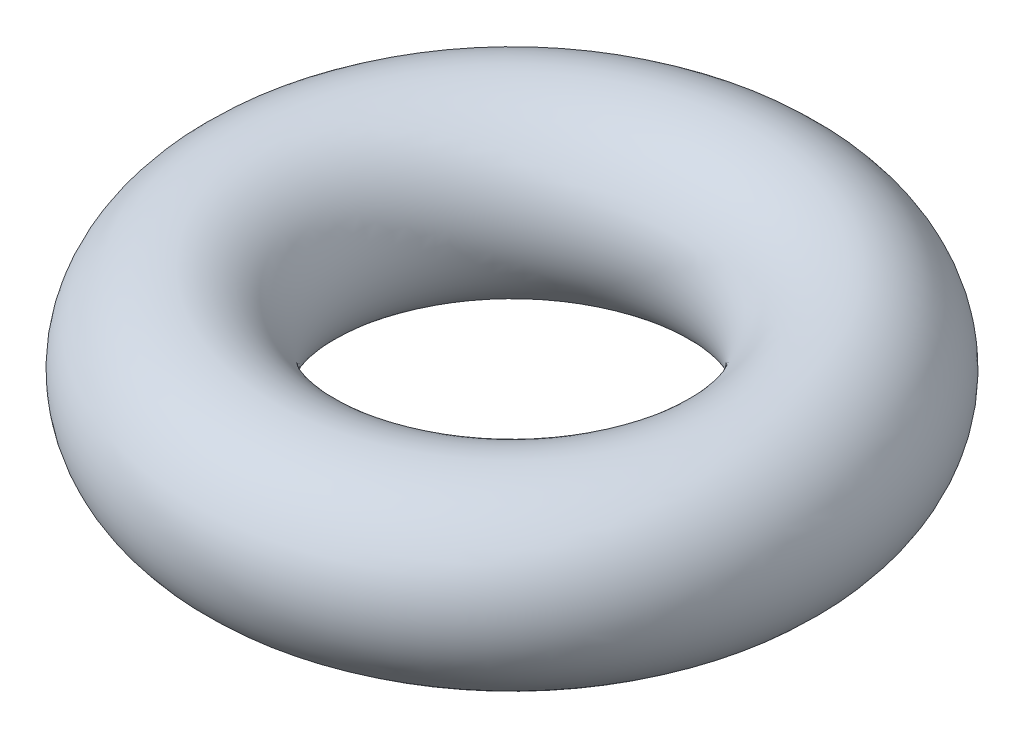
ISO-10303-21;
HEADER;
FILE_DESCRIPTION(('STEP AP214'),'2;1');
FILE_NAME('part.step','',(''),(''),'','','');
FILE_SCHEMA(('AUTOMOTIVE_DESIGN { 1 0 10303 214 1 1 1 1 }'));
ENDSEC;
DATA;
#1=APPLICATION_CONTEXT('core data for automotive mechanical design processes');
#2=APPLICATION_PROTOCOL_DEFINITION('international standard','automotive_design',2000,#1);
#3=PRODUCT_CONTEXT('',#1,'mechanical');
#4=PRODUCT('Part','Part','',(#3));
#5=PRODUCT_RELATED_PRODUCT_CATEGORY('part','',(#4));
#6=PRODUCT_DEFINITION_FORMATION('','',#4);
#7=PRODUCT_DEFINITION_CONTEXT('part definition',#1,'design');
#8=PRODUCT_DEFINITION('design','',#6,#7);
#9=PRODUCT_DEFINITION_SHAPE('','',#8);
#10=(LENGTH_UNIT() NAMED_UNIT(*) SI_UNIT(.MILLI.,.METRE.));
#11=(NAMED_UNIT(*) PLANE_ANGLE_UNIT() SI_UNIT($,.RADIAN.));
#12=(NAMED_UNIT(*) SI_UNIT($,.STERADIAN.) SOLID_ANGLE_UNIT());
#13=UNCERTAINTY_MEASURE_WITH_UNIT(LENGTH_MEASURE(1.E-05),#10,'distance_accuracy_value','');
#14=(GEOMETRIC_REPRESENTATION_CONTEXT(3) GLOBAL_UNCERTAINTY_ASSIGNED_CONTEXT((#13)) GLOBAL_UNIT_ASSIGNED_CONTEXT((#10,
#11,#12)) REPRESENTATION_CONTEXT('',''));
#15=CARTESIAN_POINT('',(0.,0.,0.));
#16=DIRECTION('',(0.,0.,1.));
#17=DIRECTION('',(1.,0.,0.));
#18=AXIS2_PLACEMENT_3D('',#15,#16,#17);
#19=CARTESIAN_POINT('',(0.,0.,0.));
#20=DIRECTION('',(0.,1.,0.));
#21=DIRECTION('',(1.,0.,0.));
#22=AXIS2_PLACEMENT_3D('',#19,#20,#21);
#23=TOROIDAL_SURFACE('',#22,4.72,1.75);
#24=ADVANCED_FACE('F14',(),#23,.T.);
#25=CLOSED_SHELL('',(#24));
#26=MANIFOLD_SOLID_BREP('B1',#25);
#27=ADVANCED_BREP_SHAPE_REPRESENTATION('',(#18,#26),#14);
#28=SHAPE_DEFINITION_REPRESENTATION(#9,#27);
ENDSEC;
END-ISO-10303-21;
